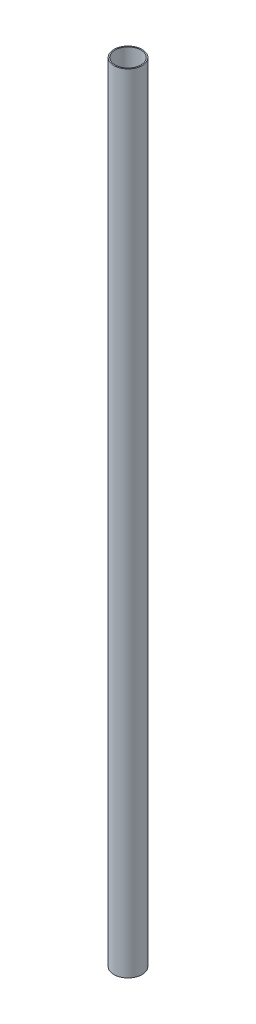
ISO-10303-21;
HEADER;
FILE_DESCRIPTION(('STEP AP214'),'2;1');
FILE_NAME('part.step','',(''),(''),'','','');
FILE_SCHEMA(('AUTOMOTIVE_DESIGN { 1 0 10303 214 1 1 1 1 }'));
ENDSEC;
DATA;
#1=APPLICATION_CONTEXT('core data for automotive mechanical design processes');
#2=APPLICATION_PROTOCOL_DEFINITION('international standard','automotive_design',2000,#1);
#3=PRODUCT_CONTEXT('',#1,'mechanical');
#4=PRODUCT('Part','Part','',(#3));
#5=PRODUCT_RELATED_PRODUCT_CATEGORY('part','',(#4));
#6=PRODUCT_DEFINITION_FORMATION('','',#4);
#7=PRODUCT_DEFINITION_CONTEXT('part definition',#1,'design');
#8=PRODUCT_DEFINITION('design','',#6,#7);
#9=PRODUCT_DEFINITION_SHAPE('','',#8);
#10=(LENGTH_UNIT() NAMED_UNIT(*) SI_UNIT(.MILLI.,.METRE.));
#11=(NAMED_UNIT(*) PLANE_ANGLE_UNIT() SI_UNIT($,.RADIAN.));
#12=(NAMED_UNIT(*) SI_UNIT($,.STERADIAN.) SOLID_ANGLE_UNIT());
#13=UNCERTAINTY_MEASURE_WITH_UNIT(LENGTH_MEASURE(1.E-05),#10,'distance_accuracy_value','');
#14=(GEOMETRIC_REPRESENTATION_CONTEXT(3) GLOBAL_UNCERTAINTY_ASSIGNED_CONTEXT((#13)) GLOBAL_UNIT_ASSIGNED_CONTEXT((#10,
#11,#12)) REPRESENTATION_CONTEXT('',''));
#15=CARTESIAN_POINT('',(0.,0.,0.));
#16=DIRECTION('',(0.,0.,1.));
#17=DIRECTION('',(1.,0.,0.));
#18=AXIS2_PLACEMENT_3D('',#15,#16,#17);
#19=CARTESIAN_POINT('',(0.,700.,0.));
#20=DIRECTION('',(0.,-1.,0.));
#21=DIRECTION('',(0.,0.,-1.));
#22=AXIS2_PLACEMENT_3D('',#19,#20,#21);
#23=CYLINDRICAL_SURFACE('',#22,12.5);
#24=CARTESIAN_POINT('',(0.,700.,0.));
#25=DIRECTION('',(0.,1.,0.));
#26=DIRECTION('',(0.,0.,1.));
#27=AXIS2_PLACEMENT_3D('',#24,#25,#26);
#28=CIRCLE('',#27,12.5);
#29=CARTESIAN_POINT('',(0.,700.,12.5));
#30=VERTEX_POINT('',#29);
#31=EDGE_CURVE('E10',#30,#30,#28,.T.);
#32=ORIENTED_EDGE('',*,*,#31,.F.);
#33=EDGE_LOOP('',(#32));
#34=FACE_BOUND('',#33,.T.);
#35=CARTESIAN_POINT('',(0.,0.,0.));
#36=DIRECTION('',(0.,1.,0.));
#37=DIRECTION('',(0.,0.,1.));
#38=AXIS2_PLACEMENT_3D('',#35,#36,#37);
#39=CIRCLE('',#38,12.5);
#40=CARTESIAN_POINT('',(0.,0.,12.5));
#41=VERTEX_POINT('',#40);
#42=EDGE_CURVE('E36',#41,#41,#39,.T.);
#43=ORIENTED_EDGE('',*,*,#42,.T.);
#44=EDGE_LOOP('',(#43));
#45=FACE_BOUND('',#44,.T.);
#46=ADVANCED_FACE('F33',(#34,#45),#23,.T.);
#47=CARTESIAN_POINT('',(0.,700.,0.));
#48=DIRECTION('',(0.,1.,0.));
#49=DIRECTION('',(0.,0.,1.));
#50=AXIS2_PLACEMENT_3D('',#47,#48,#49);
#51=PLANE('',#50);
#52=CARTESIAN_POINT('',(0.,700.,0.));
#53=DIRECTION('',(0.,1.,0.));
#54=DIRECTION('',(0.,0.,1.));
#55=AXIS2_PLACEMENT_3D('',#52,#53,#54);
#56=CIRCLE('',#55,11.5);
#57=CARTESIAN_POINT('',(0.,700.,11.5));
#58=VERTEX_POINT('',#57);
#59=EDGE_CURVE('E43',#58,#58,#56,.T.);
#60=ORIENTED_EDGE('',*,*,#59,.F.);
#61=EDGE_LOOP('',(#60));
#62=FACE_BOUND('',#61,.T.);
#63=ORIENTED_EDGE('',*,*,#31,.T.);
#64=EDGE_LOOP('',(#63));
#65=FACE_BOUND('',#64,.T.);
#66=ADVANCED_FACE('F63',(#62,#65),#51,.T.);
#67=CARTESIAN_POINT('',(0.,0.,0.));
#68=DIRECTION('',(0.,1.,0.));
#69=DIRECTION('',(0.,0.,1.));
#70=AXIS2_PLACEMENT_3D('',#67,#68,#69);
#71=PLANE('',#70);
#72=ORIENTED_EDGE('',*,*,#42,.F.);
#73=EDGE_LOOP('',(#72));
#74=FACE_BOUND('',#73,.T.);
#75=ADVANCED_FACE('F55',(#74),#71,.F.);
#76=CARTESIAN_POINT('',(0.,700.,0.));
#77=DIRECTION('',(0.,-1.,0.));
#78=DIRECTION('',(0.,0.,-1.));
#79=AXIS2_PLACEMENT_3D('',#76,#77,#78);
#80=CYLINDRICAL_SURFACE('',#79,11.5);
#81=ORIENTED_EDGE('',*,*,#59,.T.);
#82=EDGE_LOOP('',(#81));
#83=FACE_BOUND('',#82,.T.);
#84=CARTESIAN_POINT('',(0.,1.,0.));
#85=DIRECTION('',(0.,1.,0.));
#86=DIRECTION('',(0.,0.,1.));
#87=AXIS2_PLACEMENT_3D('',#84,#85,#86);
#88=CIRCLE('',#87,11.5);
#89=CARTESIAN_POINT('',(0.,1.,11.5));
#90=VERTEX_POINT('',#89);
#91=EDGE_CURVE('E47',#90,#90,#88,.T.);
#92=ORIENTED_EDGE('',*,*,#91,.F.);
#93=EDGE_LOOP('',(#92));
#94=FACE_BOUND('',#93,.T.);
#95=ADVANCED_FACE('F53',(#83,#94),#80,.F.);
#96=CARTESIAN_POINT('',(0.,1.,0.));
#97=DIRECTION('',(0.,1.,0.));
#98=DIRECTION('',(0.,0.,1.));
#99=AXIS2_PLACEMENT_3D('',#96,#97,#98);
#100=PLANE('',#99);
#101=ORIENTED_EDGE('',*,*,#91,.T.);
#102=EDGE_LOOP('',(#101));
#103=FACE_BOUND('',#102,.T.);
#104=ADVANCED_FACE('F51',(#103),#100,.T.);
#105=CLOSED_SHELL('',(#46,#66,#75,#95,#104));
#106=MANIFOLD_SOLID_BREP('B2',#105);
#107=ADVANCED_BREP_SHAPE_REPRESENTATION('',(#18,#106),#14);
#108=SHAPE_DEFINITION_REPRESENTATION(#9,#107);
ENDSEC;
END-ISO-10303-21;
